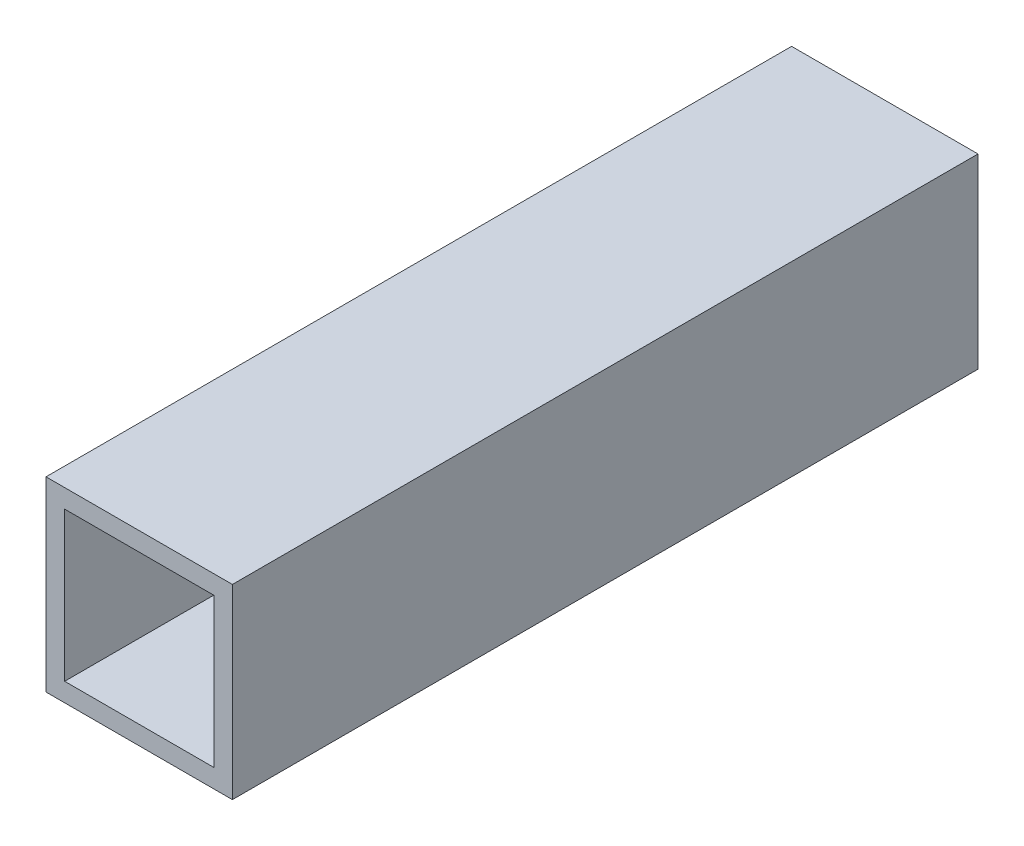
ISO-10303-21;
HEADER;
FILE_DESCRIPTION(('STEP AP214'),'2;1');
FILE_NAME('part.step','',(''),(''),'','','');
FILE_SCHEMA(('AUTOMOTIVE_DESIGN { 1 0 10303 214 1 1 1 1 }'));
ENDSEC;
DATA;
#1=APPLICATION_CONTEXT('core data for automotive mechanical design processes');
#2=APPLICATION_PROTOCOL_DEFINITION('international standard','automotive_design',2000,#1);
#3=PRODUCT_CONTEXT('',#1,'mechanical');
#4=PRODUCT('Part','Part','',(#3));
#5=PRODUCT_RELATED_PRODUCT_CATEGORY('part','',(#4));
#6=PRODUCT_DEFINITION_FORMATION('','',#4);
#7=PRODUCT_DEFINITION_CONTEXT('part definition',#1,'design');
#8=PRODUCT_DEFINITION('design','',#6,#7);
#9=PRODUCT_DEFINITION_SHAPE('','',#8);
#10=(LENGTH_UNIT() NAMED_UNIT(*) SI_UNIT(.MILLI.,.METRE.));
#11=(NAMED_UNIT(*) PLANE_ANGLE_UNIT() SI_UNIT($,.RADIAN.));
#12=(NAMED_UNIT(*) SI_UNIT($,.STERADIAN.) SOLID_ANGLE_UNIT());
#13=UNCERTAINTY_MEASURE_WITH_UNIT(LENGTH_MEASURE(1.E-05),#10,'distance_accuracy_value','');
#14=(GEOMETRIC_REPRESENTATION_CONTEXT(3) GLOBAL_UNCERTAINTY_ASSIGNED_CONTEXT((#13)) GLOBAL_UNIT_ASSIGNED_CONTEXT((#10,
#11,#12)) REPRESENTATION_CONTEXT('',''));
#15=CARTESIAN_POINT('',(0.,0.,0.));
#16=DIRECTION('',(0.,0.,1.));
#17=DIRECTION('',(1.,0.,0.));
#18=AXIS2_PLACEMENT_3D('',#15,#16,#17);
#19=CARTESIAN_POINT('',(0.,0.,200.));
#20=DIRECTION('',(0.,0.,1.));
#21=DIRECTION('',(1.,0.,0.));
#22=AXIS2_PLACEMENT_3D('',#19,#20,#21);
#23=PLANE('',#22);
#24=DIRECTION('',(0.,-1.,0.));
#25=VECTOR('',#24,1.);
#26=CARTESIAN_POINT('',(-25.,25.,200.));
#27=LINE('',#26,#25);
#28=CARTESIAN_POINT('',(-25.,25.,200.));
#29=VERTEX_POINT('',#28);
#30=CARTESIAN_POINT('',(-25.,-25.,200.));
#31=VERTEX_POINT('',#30);
#32=EDGE_CURVE('E153',#29,#31,#27,.T.);
#33=ORIENTED_EDGE('',*,*,#32,.T.);
#34=DIRECTION('',(1.,0.,0.));
#35=VECTOR('',#34,1.);
#36=CARTESIAN_POINT('',(-25.,-25.,200.));
#37=LINE('',#36,#35);
#38=CARTESIAN_POINT('',(25.,-25.,200.));
#39=VERTEX_POINT('',#38);
#40=EDGE_CURVE('E157',#31,#39,#37,.T.);
#41=ORIENTED_EDGE('',*,*,#40,.T.);
#42=DIRECTION('',(0.,1.,0.));
#43=VECTOR('',#42,1.);
#44=CARTESIAN_POINT('',(25.,25.,200.));
#45=LINE('',#44,#43);
#46=CARTESIAN_POINT('',(25.,25.,200.));
#47=VERTEX_POINT('',#46);
#48=EDGE_CURVE('E161',#39,#47,#45,.T.);
#49=ORIENTED_EDGE('',*,*,#48,.T.);
#50=DIRECTION('',(-1.,0.,0.));
#51=VECTOR('',#50,1.);
#52=CARTESIAN_POINT('',(-25.,25.,200.));
#53=LINE('',#52,#51);
#54=EDGE_CURVE('E164',#47,#29,#53,.T.);
#55=ORIENTED_EDGE('',*,*,#54,.T.);
#56=EDGE_LOOP('',(#33,#41,#49,#55));
#57=FACE_BOUND('',#56,.T.);
#58=DIRECTION('',(0.,-1.,0.));
#59=VECTOR('',#58,1.);
#60=CARTESIAN_POINT('',(-20.,20.,200.));
#61=LINE('',#60,#59);
#62=CARTESIAN_POINT('',(-20.,20.,200.));
#63=VERTEX_POINT('',#62);
#64=CARTESIAN_POINT('',(-20.,-20.,200.));
#65=VERTEX_POINT('',#64);
#66=EDGE_CURVE('E114',#63,#65,#61,.T.);
#67=ORIENTED_EDGE('',*,*,#66,.F.);
#68=DIRECTION('',(-1.,0.,0.));
#69=VECTOR('',#68,1.);
#70=CARTESIAN_POINT('',(-20.,20.,200.));
#71=LINE('',#70,#69);
#72=CARTESIAN_POINT('',(20.,20.,200.));
#73=VERTEX_POINT('',#72);
#74=EDGE_CURVE('E105',#73,#63,#71,.T.);
#75=ORIENTED_EDGE('',*,*,#74,.F.);
#76=DIRECTION('',(0.,1.,0.));
#77=VECTOR('',#76,1.);
#78=CARTESIAN_POINT('',(20.,20.,200.));
#79=LINE('',#78,#77);
#80=CARTESIAN_POINT('',(20.,-20.,200.));
#81=VERTEX_POINT('',#80);
#82=EDGE_CURVE('E131',#81,#73,#79,.T.);
#83=ORIENTED_EDGE('',*,*,#82,.F.);
#84=DIRECTION('',(1.,0.,0.));
#85=VECTOR('',#84,1.);
#86=CARTESIAN_POINT('',(-20.,-20.,200.));
#87=LINE('',#86,#85);
#88=EDGE_CURVE('E127',#65,#81,#87,.T.);
#89=ORIENTED_EDGE('',*,*,#88,.F.);
#90=EDGE_LOOP('',(#67,#75,#83,#89));
#91=FACE_BOUND('',#90,.T.);
#92=ADVANCED_FACE('F39',(#57,#91),#23,.T.);
#93=CARTESIAN_POINT('',(0.,0.,0.));
#94=DIRECTION('',(0.,0.,1.));
#95=DIRECTION('',(1.,0.,0.));
#96=AXIS2_PLACEMENT_3D('',#93,#94,#95);
#97=PLANE('',#96);
#98=DIRECTION('',(0.,-1.,0.));
#99=VECTOR('',#98,1.);
#100=CARTESIAN_POINT('',(-25.,25.,0.));
#101=LINE('',#100,#99);
#102=CARTESIAN_POINT('',(-25.,25.,0.));
#103=VERTEX_POINT('',#102);
#104=CARTESIAN_POINT('',(-25.,-25.,0.));
#105=VERTEX_POINT('',#104);
#106=EDGE_CURVE('E123',#103,#105,#101,.T.);
#107=ORIENTED_EDGE('',*,*,#106,.F.);
#108=DIRECTION('',(-1.,0.,0.));
#109=VECTOR('',#108,1.);
#110=CARTESIAN_POINT('',(-25.,25.,0.));
#111=LINE('',#110,#109);
#112=CARTESIAN_POINT('',(25.,25.,0.));
#113=VERTEX_POINT('',#112);
#114=EDGE_CURVE('E158',#113,#103,#111,.T.);
#115=ORIENTED_EDGE('',*,*,#114,.F.);
#116=DIRECTION('',(0.,1.,0.));
#117=VECTOR('',#116,1.);
#118=CARTESIAN_POINT('',(25.,25.,0.));
#119=LINE('',#118,#117);
#120=CARTESIAN_POINT('',(25.,-25.,0.));
#121=VERTEX_POINT('',#120);
#122=EDGE_CURVE('E174',#121,#113,#119,.T.);
#123=ORIENTED_EDGE('',*,*,#122,.F.);
#124=DIRECTION('',(1.,0.,0.));
#125=VECTOR('',#124,1.);
#126=CARTESIAN_POINT('',(-25.,-25.,0.));
#127=LINE('',#126,#125);
#128=EDGE_CURVE('E171',#105,#121,#127,.T.);
#129=ORIENTED_EDGE('',*,*,#128,.F.);
#130=EDGE_LOOP('',(#107,#115,#123,#129));
#131=FACE_BOUND('',#130,.T.);
#132=DIRECTION('',(-1.,0.,0.));
#133=VECTOR('',#132,1.);
#134=CARTESIAN_POINT('',(-20.,20.,0.));
#135=LINE('',#134,#133);
#136=CARTESIAN_POINT('',(20.,20.,0.));
#137=VERTEX_POINT('',#136);
#138=CARTESIAN_POINT('',(-20.,20.,0.));
#139=VERTEX_POINT('',#138);
#140=EDGE_CURVE('E63',#137,#139,#135,.T.);
#141=ORIENTED_EDGE('',*,*,#140,.T.);
#142=DIRECTION('',(0.,-1.,0.));
#143=VECTOR('',#142,1.);
#144=CARTESIAN_POINT('',(-20.,20.,0.));
#145=LINE('',#144,#143);
#146=CARTESIAN_POINT('',(-20.,-20.,0.));
#147=VERTEX_POINT('',#146);
#148=EDGE_CURVE('E121',#139,#147,#145,.T.);
#149=ORIENTED_EDGE('',*,*,#148,.T.);
#150=DIRECTION('',(1.,0.,0.));
#151=VECTOR('',#150,1.);
#152=CARTESIAN_POINT('',(-20.,-20.,0.));
#153=LINE('',#152,#151);
#154=CARTESIAN_POINT('',(20.,-20.,0.));
#155=VERTEX_POINT('',#154);
#156=EDGE_CURVE('E140',#147,#155,#153,.T.);
#157=ORIENTED_EDGE('',*,*,#156,.T.);
#158=DIRECTION('',(0.,1.,0.));
#159=VECTOR('',#158,1.);
#160=CARTESIAN_POINT('',(20.,20.,0.));
#161=LINE('',#160,#159);
#162=EDGE_CURVE('E115',#155,#137,#161,.T.);
#163=ORIENTED_EDGE('',*,*,#162,.T.);
#164=EDGE_LOOP('',(#141,#149,#157,#163));
#165=FACE_BOUND('',#164,.T.);
#166=ADVANCED_FACE('F197',(#131,#165),#97,.F.);
#167=CARTESIAN_POINT('',(-25.,25.,200.));
#168=DIRECTION('',(1.,0.,0.));
#169=DIRECTION('',(0.,1.,0.));
#170=AXIS2_PLACEMENT_3D('',#167,#168,#169);
#171=PLANE('',#170);
#172=ORIENTED_EDGE('',*,*,#106,.T.);
#173=DIRECTION('',(0.,0.,-1.));
#174=VECTOR('',#173,1.);
#175=CARTESIAN_POINT('',(-25.,-25.,200.));
#176=LINE('',#175,#174);
#177=EDGE_CURVE('E11',#31,#105,#176,.T.);
#178=ORIENTED_EDGE('',*,*,#177,.F.);
#179=ORIENTED_EDGE('',*,*,#32,.F.);
#180=DIRECTION('',(0.,0.,-1.));
#181=VECTOR('',#180,1.);
#182=CARTESIAN_POINT('',(-25.,25.,200.));
#183=LINE('',#182,#181);
#184=EDGE_CURVE('E167',#29,#103,#183,.T.);
#185=ORIENTED_EDGE('',*,*,#184,.T.);
#186=EDGE_LOOP('',(#172,#178,#179,#185));
#187=FACE_BOUND('',#186,.T.);
#188=ADVANCED_FACE('F41',(#187),#171,.F.);
#189=CARTESIAN_POINT('',(-25.,-25.,200.));
#190=DIRECTION('',(0.,1.,0.));
#191=DIRECTION('',(0.,0.,1.));
#192=AXIS2_PLACEMENT_3D('',#189,#190,#191);
#193=PLANE('',#192);
#194=ORIENTED_EDGE('',*,*,#128,.T.);
#195=DIRECTION('',(0.,0.,-1.));
#196=VECTOR('',#195,1.);
#197=CARTESIAN_POINT('',(25.,-25.,200.));
#198=LINE('',#197,#196);
#199=EDGE_CURVE('E48',#39,#121,#198,.T.);
#200=ORIENTED_EDGE('',*,*,#199,.F.);
#201=ORIENTED_EDGE('',*,*,#40,.F.);
#202=ORIENTED_EDGE('',*,*,#177,.T.);
#203=EDGE_LOOP('',(#194,#200,#201,#202));
#204=FACE_BOUND('',#203,.T.);
#205=ADVANCED_FACE('F207',(#204),#193,.F.);
#206=CARTESIAN_POINT('',(25.,25.,200.));
#207=DIRECTION('',(-1.,0.,0.));
#208=DIRECTION('',(0.,-1.,0.));
#209=AXIS2_PLACEMENT_3D('',#206,#207,#208);
#210=PLANE('',#209);
#211=ORIENTED_EDGE('',*,*,#122,.T.);
#212=DIRECTION('',(0.,0.,-1.));
#213=VECTOR('',#212,1.);
#214=CARTESIAN_POINT('',(25.,25.,200.));
#215=LINE('',#214,#213);
#216=EDGE_CURVE('E182',#47,#113,#215,.T.);
#217=ORIENTED_EDGE('',*,*,#216,.F.);
#218=ORIENTED_EDGE('',*,*,#48,.F.);
#219=ORIENTED_EDGE('',*,*,#199,.T.);
#220=EDGE_LOOP('',(#211,#217,#218,#219));
#221=FACE_BOUND('',#220,.T.);
#222=ADVANCED_FACE('F191',(#221),#210,.F.);
#223=CARTESIAN_POINT('',(-25.,25.,200.));
#224=DIRECTION('',(0.,-1.,0.));
#225=DIRECTION('',(0.,0.,-1.));
#226=AXIS2_PLACEMENT_3D('',#223,#224,#225);
#227=PLANE('',#226);
#228=ORIENTED_EDGE('',*,*,#114,.T.);
#229=ORIENTED_EDGE('',*,*,#184,.F.);
#230=ORIENTED_EDGE('',*,*,#54,.F.);
#231=ORIENTED_EDGE('',*,*,#216,.T.);
#232=EDGE_LOOP('',(#228,#229,#230,#231));
#233=FACE_BOUND('',#232,.T.);
#234=ADVANCED_FACE('F201',(#233),#227,.F.);
#235=CARTESIAN_POINT('',(-20.,20.,200.));
#236=DIRECTION('',(0.,-1.,0.));
#237=DIRECTION('',(0.,0.,-1.));
#238=AXIS2_PLACEMENT_3D('',#235,#236,#237);
#239=PLANE('',#238);
#240=ORIENTED_EDGE('',*,*,#140,.F.);
#241=DIRECTION('',(0.,0.,-1.));
#242=VECTOR('',#241,1.);
#243=CARTESIAN_POINT('',(20.,20.,200.));
#244=LINE('',#243,#242);
#245=EDGE_CURVE('E109',#73,#137,#244,.T.);
#246=ORIENTED_EDGE('',*,*,#245,.F.);
#247=ORIENTED_EDGE('',*,*,#74,.T.);
#248=DIRECTION('',(0.,0.,-1.));
#249=VECTOR('',#248,1.);
#250=CARTESIAN_POINT('',(-20.,20.,200.));
#251=LINE('',#250,#249);
#252=EDGE_CURVE('E108',#63,#139,#251,.T.);
#253=ORIENTED_EDGE('',*,*,#252,.T.);
#254=EDGE_LOOP('',(#240,#246,#247,#253));
#255=FACE_BOUND('',#254,.T.);
#256=ADVANCED_FACE('F107',(#255),#239,.T.);
#257=CARTESIAN_POINT('',(-20.,20.,200.));
#258=DIRECTION('',(1.,0.,0.));
#259=DIRECTION('',(0.,1.,0.));
#260=AXIS2_PLACEMENT_3D('',#257,#258,#259);
#261=PLANE('',#260);
#262=ORIENTED_EDGE('',*,*,#148,.F.);
#263=ORIENTED_EDGE('',*,*,#252,.F.);
#264=ORIENTED_EDGE('',*,*,#66,.T.);
#265=DIRECTION('',(0.,0.,-1.));
#266=VECTOR('',#265,1.);
#267=CARTESIAN_POINT('',(-20.,-20.,200.));
#268=LINE('',#267,#266);
#269=EDGE_CURVE('E124',#65,#147,#268,.T.);
#270=ORIENTED_EDGE('',*,*,#269,.T.);
#271=EDGE_LOOP('',(#262,#263,#264,#270));
#272=FACE_BOUND('',#271,.T.);
#273=ADVANCED_FACE('F118',(#272),#261,.T.);
#274=CARTESIAN_POINT('',(-20.,-20.,200.));
#275=DIRECTION('',(0.,1.,0.));
#276=DIRECTION('',(0.,0.,1.));
#277=AXIS2_PLACEMENT_3D('',#274,#275,#276);
#278=PLANE('',#277);
#279=ORIENTED_EDGE('',*,*,#156,.F.);
#280=ORIENTED_EDGE('',*,*,#269,.F.);
#281=ORIENTED_EDGE('',*,*,#88,.T.);
#282=DIRECTION('',(0.,0.,-1.));
#283=VECTOR('',#282,1.);
#284=CARTESIAN_POINT('',(20.,-20.,200.));
#285=LINE('',#284,#283);
#286=EDGE_CURVE('E55',#81,#155,#285,.T.);
#287=ORIENTED_EDGE('',*,*,#286,.T.);
#288=EDGE_LOOP('',(#279,#280,#281,#287));
#289=FACE_BOUND('',#288,.T.);
#290=ADVANCED_FACE('F230',(#289),#278,.T.);
#291=CARTESIAN_POINT('',(20.,20.,200.));
#292=DIRECTION('',(-1.,0.,0.));
#293=DIRECTION('',(0.,-1.,0.));
#294=AXIS2_PLACEMENT_3D('',#291,#292,#293);
#295=PLANE('',#294);
#296=ORIENTED_EDGE('',*,*,#162,.F.);
#297=ORIENTED_EDGE('',*,*,#286,.F.);
#298=ORIENTED_EDGE('',*,*,#82,.T.);
#299=ORIENTED_EDGE('',*,*,#245,.T.);
#300=EDGE_LOOP('',(#296,#297,#298,#299));
#301=FACE_BOUND('',#300,.T.);
#302=ADVANCED_FACE('F234',(#301),#295,.T.);
#303=CLOSED_SHELL('',(#92,#166,#188,#205,#222,#234,#256,#273,#290,#302));
#304=MANIFOLD_SOLID_BREP('B2',#303);
#305=ADVANCED_BREP_SHAPE_REPRESENTATION('',(#18,#304),#14);
#306=SHAPE_DEFINITION_REPRESENTATION(#9,#305);
ENDSEC;
END-ISO-10303-21;
